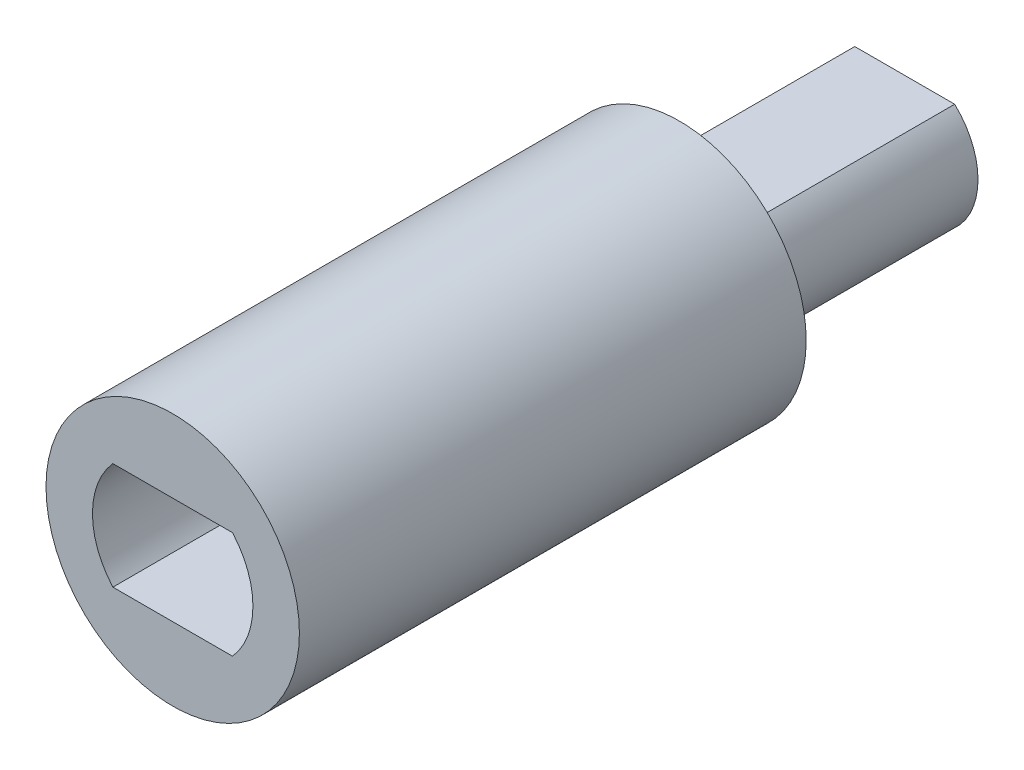
ISO-10303-21;
HEADER;
FILE_DESCRIPTION(('STEP AP214'),'2;1');
FILE_NAME('part.step','',(''),(''),'','','');
FILE_SCHEMA(('AUTOMOTIVE_DESIGN { 1 0 10303 214 1 1 1 1 }'));
ENDSEC;
DATA;
#1=APPLICATION_CONTEXT('core data for automotive mechanical design processes');
#2=APPLICATION_PROTOCOL_DEFINITION('international standard','automotive_design',2000,#1);
#3=PRODUCT_CONTEXT('',#1,'mechanical');
#4=PRODUCT('Part','Part','',(#3));
#5=PRODUCT_RELATED_PRODUCT_CATEGORY('part','',(#4));
#6=PRODUCT_DEFINITION_FORMATION('','',#4);
#7=PRODUCT_DEFINITION_CONTEXT('part definition',#1,'design');
#8=PRODUCT_DEFINITION('design','',#6,#7);
#9=PRODUCT_DEFINITION_SHAPE('','',#8);
#10=(LENGTH_UNIT() NAMED_UNIT(*) SI_UNIT(.MILLI.,.METRE.));
#11=(NAMED_UNIT(*) PLANE_ANGLE_UNIT() SI_UNIT($,.RADIAN.));
#12=(NAMED_UNIT(*) SI_UNIT($,.STERADIAN.) SOLID_ANGLE_UNIT());
#13=UNCERTAINTY_MEASURE_WITH_UNIT(LENGTH_MEASURE(1.E-05),#10,'distance_accuracy_value','');
#14=(GEOMETRIC_REPRESENTATION_CONTEXT(3) GLOBAL_UNCERTAINTY_ASSIGNED_CONTEXT((#13)) GLOBAL_UNIT_ASSIGNED_CONTEXT((#10,
#11,#12)) REPRESENTATION_CONTEXT('',''));
#15=CARTESIAN_POINT('',(0.,0.,0.));
#16=DIRECTION('',(0.,0.,1.));
#17=DIRECTION('',(1.,0.,0.));
#18=AXIS2_PLACEMENT_3D('',#15,#16,#17);
#19=CARTESIAN_POINT('',(0.,0.,18.));
#20=DIRECTION('',(0.,0.,-1.));
#21=DIRECTION('',(-1.,0.,0.));
#22=AXIS2_PLACEMENT_3D('',#19,#20,#21);
#23=CYLINDRICAL_SURFACE('',#22,4.5);
#24=CARTESIAN_POINT('',(0.,0.,18.));
#25=DIRECTION('',(0.,0.,1.));
#26=DIRECTION('',(1.,0.,0.));
#27=AXIS2_PLACEMENT_3D('',#24,#25,#26);
#28=CIRCLE('',#27,4.5);
#29=CARTESIAN_POINT('',(4.5,0.,18.));
#30=VERTEX_POINT('',#29);
#31=EDGE_CURVE('E11',#30,#30,#28,.T.);
#32=ORIENTED_EDGE('',*,*,#31,.F.);
#33=EDGE_LOOP('',(#32));
#34=FACE_BOUND('',#33,.T.);
#35=CARTESIAN_POINT('',(0.,0.,0.));
#36=DIRECTION('',(0.,0.,1.));
#37=DIRECTION('',(1.,0.,0.));
#38=AXIS2_PLACEMENT_3D('',#35,#36,#37);
#39=CIRCLE('',#38,4.5);
#40=CARTESIAN_POINT('',(4.5,0.,0.));
#41=VERTEX_POINT('',#40);
#42=EDGE_CURVE('E36',#41,#41,#39,.T.);
#43=ORIENTED_EDGE('',*,*,#42,.T.);
#44=EDGE_LOOP('',(#43));
#45=FACE_BOUND('',#44,.T.);
#46=ADVANCED_FACE('F33',(#34,#45),#23,.T.);
#47=CARTESIAN_POINT('',(0.,0.,18.));
#48=DIRECTION('',(0.,0.,1.));
#49=DIRECTION('',(1.,0.,0.));
#50=AXIS2_PLACEMENT_3D('',#47,#48,#49);
#51=PLANE('',#50);
#52=CARTESIAN_POINT('',(0.,0.,18.));
#53=DIRECTION('',(0.,0.,1.));
#54=DIRECTION('',(1.,0.,0.));
#55=AXIS2_PLACEMENT_3D('',#52,#53,#54);
#56=CIRCLE('',#55,2.85);
#57=CARTESIAN_POINT('',(-2.1242645786248,1.9,18.));
#58=VERTEX_POINT('',#57);
#59=CARTESIAN_POINT('',(-2.1242645786248,-1.9,18.));
#60=VERTEX_POINT('',#59);
#61=EDGE_CURVE('E47',#58,#60,#56,.T.);
#62=ORIENTED_EDGE('',*,*,#61,.F.);
#63=DIRECTION('',(-1.,0.,0.));
#64=VECTOR('',#63,1.);
#65=CARTESIAN_POINT('',(0.,1.9,18.));
#66=LINE('',#65,#64);
#67=CARTESIAN_POINT('',(2.1242645786248,1.9,18.));
#68=VERTEX_POINT('',#67);
#69=EDGE_CURVE('E117',#68,#58,#66,.T.);
#70=ORIENTED_EDGE('',*,*,#69,.F.);
#71=CARTESIAN_POINT('',(0.,0.,18.));
#72=DIRECTION('',(0.,0.,1.));
#73=DIRECTION('',(1.,0.,0.));
#74=AXIS2_PLACEMENT_3D('',#71,#72,#73);
#75=CIRCLE('',#74,2.85);
#76=CARTESIAN_POINT('',(2.1242645786248,-1.9,18.));
#77=VERTEX_POINT('',#76);
#78=EDGE_CURVE('E120',#77,#68,#75,.T.);
#79=ORIENTED_EDGE('',*,*,#78,.F.);
#80=DIRECTION('',(-1.,0.,0.));
#81=VECTOR('',#80,1.);
#82=CARTESIAN_POINT('',(0.,-1.9,18.));
#83=LINE('',#82,#81);
#84=EDGE_CURVE('E126',#77,#60,#83,.T.);
#85=ORIENTED_EDGE('',*,*,#84,.T.);
#86=EDGE_LOOP('',(#62,#70,#79,#85));
#87=FACE_BOUND('',#86,.T.);
#88=ORIENTED_EDGE('',*,*,#31,.T.);
#89=EDGE_LOOP('',(#88));
#90=FACE_BOUND('',#89,.T.);
#91=ADVANCED_FACE('F192',(#87,#90),#51,.T.);
#92=CARTESIAN_POINT('',(0.,0.,0.));
#93=DIRECTION('',(0.,0.,1.));
#94=DIRECTION('',(1.,0.,0.));
#95=AXIS2_PLACEMENT_3D('',#92,#93,#94);
#96=PLANE('',#95);
#97=DIRECTION('',(1.,0.,0.));
#98=VECTOR('',#97,1.);
#99=CARTESIAN_POINT('',(1.97339969930355,-1.69638982246842,0.));
#100=LINE('',#99,#98);
#101=CARTESIAN_POINT('',(-1.97339969930355,-1.69638982246842,0.));
#102=VERTEX_POINT('',#101);
#103=CARTESIAN_POINT('',(1.97339969930355,-1.69638982246842,0.));
#104=VERTEX_POINT('',#103);
#105=EDGE_CURVE('E139',#102,#104,#100,.T.);
#106=ORIENTED_EDGE('',*,*,#105,.T.);
#107=CARTESIAN_POINT('',(0.,0.,0.));
#108=DIRECTION('',(0.,0.,1.));
#109=DIRECTION('',(1.,0.,0.));
#110=AXIS2_PLACEMENT_3D('',#107,#108,#109);
#111=CIRCLE('',#110,2.6023152773993);
#112=CARTESIAN_POINT('',(1.77434863963765,1.90361017753158,0.));
#113=VERTEX_POINT('',#112);
#114=EDGE_CURVE('E55',#104,#113,#111,.T.);
#115=ORIENTED_EDGE('',*,*,#114,.T.);
#116=DIRECTION('',(-1.,0.,0.));
#117=VECTOR('',#116,1.);
#118=CARTESIAN_POINT('',(1.77434863963765,1.90361017753158,0.));
#119=LINE('',#118,#117);
#120=CARTESIAN_POINT('',(-1.77434863963765,1.90361017753158,0.));
#121=VERTEX_POINT('',#120);
#122=EDGE_CURVE('E150',#113,#121,#119,.T.);
#123=ORIENTED_EDGE('',*,*,#122,.T.);
#124=CARTESIAN_POINT('',(0.,0.,0.));
#125=DIRECTION('',(0.,0.,1.));
#126=DIRECTION('',(1.,0.,0.));
#127=AXIS2_PLACEMENT_3D('',#124,#125,#126);
#128=CIRCLE('',#127,2.6023152773993);
#129=EDGE_CURVE('E153',#121,#102,#128,.T.);
#130=ORIENTED_EDGE('',*,*,#129,.T.);
#131=EDGE_LOOP('',(#106,#115,#123,#130));
#132=FACE_BOUND('',#131,.T.);
#133=ORIENTED_EDGE('',*,*,#42,.F.);
#134=EDGE_LOOP('',(#133));
#135=FACE_BOUND('',#134,.T.);
#136=ADVANCED_FACE('F172',(#132,#135),#96,.F.);
#137=CARTESIAN_POINT('',(0.,0.,-8.));
#138=DIRECTION('',(0.,0.,1.));
#139=DIRECTION('',(1.,0.,0.));
#140=AXIS2_PLACEMENT_3D('',#137,#138,#139);
#141=CYLINDRICAL_SURFACE('',#140,2.6023152773993);
#142=ORIENTED_EDGE('',*,*,#114,.F.);
#143=DIRECTION('',(0.,0.,1.));
#144=VECTOR('',#143,1.);
#145=CARTESIAN_POINT('',(1.97339969930355,-1.69638982246842,-8.));
#146=LINE('',#145,#144);
#147=CARTESIAN_POINT('',(1.97339969930355,-1.69638982246842,-8.));
#148=VERTEX_POINT('',#147);
#149=EDGE_CURVE('E158',#148,#104,#146,.T.);
#150=ORIENTED_EDGE('',*,*,#149,.F.);
#151=CARTESIAN_POINT('',(0.,0.,-8.));
#152=DIRECTION('',(0.,0.,1.));
#153=DIRECTION('',(1.,0.,0.));
#154=AXIS2_PLACEMENT_3D('',#151,#152,#153);
#155=CIRCLE('',#154,2.6023152773993);
#156=CARTESIAN_POINT('',(1.77434863963765,1.90361017753158,-8.));
#157=VERTEX_POINT('',#156);
#158=EDGE_CURVE('E135',#148,#157,#155,.T.);
#159=ORIENTED_EDGE('',*,*,#158,.T.);
#160=DIRECTION('',(0.,0.,1.));
#161=VECTOR('',#160,1.);
#162=CARTESIAN_POINT('',(1.77434863963765,1.90361017753158,-8.));
#163=LINE('',#162,#161);
#164=EDGE_CURVE('E148',#157,#113,#163,.T.);
#165=ORIENTED_EDGE('',*,*,#164,.T.);
#166=EDGE_LOOP('',(#142,#150,#159,#165));
#167=FACE_BOUND('',#166,.T.);
#168=ADVANCED_FACE('F165',(#167),#141,.T.);
#169=CARTESIAN_POINT('',(1.97339969930355,-1.69638982246842,-8.));
#170=DIRECTION('',(0.,-1.,0.));
#171=DIRECTION('',(0.,0.,-1.));
#172=AXIS2_PLACEMENT_3D('',#169,#170,#171);
#173=PLANE('',#172);
#174=ORIENTED_EDGE('',*,*,#105,.F.);
#175=DIRECTION('',(0.,0.,1.));
#176=VECTOR('',#175,1.);
#177=CARTESIAN_POINT('',(-1.97339969930355,-1.69638982246842,-8.));
#178=LINE('',#177,#176);
#179=CARTESIAN_POINT('',(-1.97339969930355,-1.69638982246842,-8.));
#180=VERTEX_POINT('',#179);
#181=EDGE_CURVE('E160',#180,#102,#178,.T.);
#182=ORIENTED_EDGE('',*,*,#181,.F.);
#183=DIRECTION('',(1.,0.,0.));
#184=VECTOR('',#183,1.);
#185=CARTESIAN_POINT('',(1.97339969930355,-1.69638982246842,-8.));
#186=LINE('',#185,#184);
#187=EDGE_CURVE('E145',#180,#148,#186,.T.);
#188=ORIENTED_EDGE('',*,*,#187,.T.);
#189=ORIENTED_EDGE('',*,*,#149,.T.);
#190=EDGE_LOOP('',(#174,#182,#188,#189));
#191=FACE_BOUND('',#190,.T.);
#192=ADVANCED_FACE('F176',(#191),#173,.T.);
#193=CARTESIAN_POINT('',(0.,0.,-8.));
#194=DIRECTION('',(0.,0.,1.));
#195=DIRECTION('',(1.,0.,0.));
#196=AXIS2_PLACEMENT_3D('',#193,#194,#195);
#197=CYLINDRICAL_SURFACE('',#196,2.6023152773993);
#198=ORIENTED_EDGE('',*,*,#129,.F.);
#199=DIRECTION('',(0.,0.,1.));
#200=VECTOR('',#199,1.);
#201=CARTESIAN_POINT('',(-1.77434863963765,1.90361017753158,-8.));
#202=LINE('',#201,#200);
#203=CARTESIAN_POINT('',(-1.77434863963765,1.90361017753158,-8.));
#204=VERTEX_POINT('',#203);
#205=EDGE_CURVE('E162',#204,#121,#202,.T.);
#206=ORIENTED_EDGE('',*,*,#205,.F.);
#207=CARTESIAN_POINT('',(0.,0.,-8.));
#208=DIRECTION('',(0.,0.,1.));
#209=DIRECTION('',(1.,0.,0.));
#210=AXIS2_PLACEMENT_3D('',#207,#208,#209);
#211=CIRCLE('',#210,2.6023152773993);
#212=EDGE_CURVE('E142',#204,#180,#211,.T.);
#213=ORIENTED_EDGE('',*,*,#212,.T.);
#214=ORIENTED_EDGE('',*,*,#181,.T.);
#215=EDGE_LOOP('',(#198,#206,#213,#214));
#216=FACE_BOUND('',#215,.T.);
#217=ADVANCED_FACE('F182',(#216),#197,.T.);
#218=CARTESIAN_POINT('',(1.77434863963765,1.90361017753158,-8.));
#219=DIRECTION('',(0.,1.,0.));
#220=DIRECTION('',(0.,0.,1.));
#221=AXIS2_PLACEMENT_3D('',#218,#219,#220);
#222=PLANE('',#221);
#223=ORIENTED_EDGE('',*,*,#122,.F.);
#224=ORIENTED_EDGE('',*,*,#164,.F.);
#225=DIRECTION('',(-1.,0.,0.));
#226=VECTOR('',#225,1.);
#227=CARTESIAN_POINT('',(1.77434863963765,1.90361017753158,-8.));
#228=LINE('',#227,#226);
#229=EDGE_CURVE('E138',#157,#204,#228,.T.);
#230=ORIENTED_EDGE('',*,*,#229,.T.);
#231=ORIENTED_EDGE('',*,*,#205,.T.);
#232=EDGE_LOOP('',(#223,#224,#230,#231));
#233=FACE_BOUND('',#232,.T.);
#234=ADVANCED_FACE('F169',(#233),#222,.T.);
#235=CARTESIAN_POINT('',(0.,0.,-8.));
#236=DIRECTION('',(0.,0.,1.));
#237=DIRECTION('',(1.,0.,0.));
#238=AXIS2_PLACEMENT_3D('',#235,#236,#237);
#239=PLANE('',#238);
#240=ORIENTED_EDGE('',*,*,#158,.F.);
#241=ORIENTED_EDGE('',*,*,#187,.F.);
#242=ORIENTED_EDGE('',*,*,#212,.F.);
#243=ORIENTED_EDGE('',*,*,#229,.F.);
#244=EDGE_LOOP('',(#240,#241,#242,#243));
#245=FACE_BOUND('',#244,.T.);
#246=ADVANCED_FACE('F179',(#245),#239,.F.);
#247=CARTESIAN_POINT('',(0.,0.,10.));
#248=DIRECTION('',(0.,0.,1.));
#249=DIRECTION('',(1.,0.,0.));
#250=AXIS2_PLACEMENT_3D('',#247,#248,#249);
#251=CYLINDRICAL_SURFACE('',#250,2.85);
#252=ORIENTED_EDGE('',*,*,#61,.T.);
#253=DIRECTION('',(0.,0.,1.));
#254=VECTOR('',#253,1.);
#255=CARTESIAN_POINT('',(-2.1242645786248,-1.9,10.));
#256=LINE('',#255,#254);
#257=CARTESIAN_POINT('',(-2.1242645786248,-1.9,10.));
#258=VERTEX_POINT('',#257);
#259=EDGE_CURVE('E100',#258,#60,#256,.T.);
#260=ORIENTED_EDGE('',*,*,#259,.F.);
#261=CARTESIAN_POINT('',(0.,0.,10.));
#262=DIRECTION('',(0.,0.,1.));
#263=DIRECTION('',(1.,0.,0.));
#264=AXIS2_PLACEMENT_3D('',#261,#262,#263);
#265=CIRCLE('',#264,2.85);
#266=CARTESIAN_POINT('',(-2.1242645786248,1.9,10.));
#267=VERTEX_POINT('',#266);
#268=EDGE_CURVE('E108',#267,#258,#265,.T.);
#269=ORIENTED_EDGE('',*,*,#268,.F.);
#270=DIRECTION('',(0.,0.,1.));
#271=VECTOR('',#270,1.);
#272=CARTESIAN_POINT('',(-2.1242645786248,1.9,10.));
#273=LINE('',#272,#271);
#274=EDGE_CURVE('E130',#267,#58,#273,.T.);
#275=ORIENTED_EDGE('',*,*,#274,.T.);
#276=EDGE_LOOP('',(#252,#260,#269,#275));
#277=FACE_BOUND('',#276,.T.);
#278=ADVANCED_FACE('F111',(#277),#251,.F.);
#279=CARTESIAN_POINT('',(0.,1.9,10.));
#280=DIRECTION('',(0.,1.,0.));
#281=DIRECTION('',(-1.,0.,0.));
#282=AXIS2_PLACEMENT_3D('',#279,#280,#281);
#283=PLANE('',#282);
#284=ORIENTED_EDGE('',*,*,#69,.T.);
#285=ORIENTED_EDGE('',*,*,#274,.F.);
#286=DIRECTION('',(-1.,0.,0.));
#287=VECTOR('',#286,1.);
#288=CARTESIAN_POINT('',(0.,1.9,10.));
#289=LINE('',#288,#287);
#290=CARTESIAN_POINT('',(2.1242645786248,1.9,10.));
#291=VERTEX_POINT('',#290);
#292=EDGE_CURVE('E113',#291,#267,#289,.T.);
#293=ORIENTED_EDGE('',*,*,#292,.F.);
#294=DIRECTION('',(0.,0.,1.));
#295=VECTOR('',#294,1.);
#296=CARTESIAN_POINT('',(2.1242645786248,1.9,10.));
#297=LINE('',#296,#295);
#298=EDGE_CURVE('E132',#291,#68,#297,.T.);
#299=ORIENTED_EDGE('',*,*,#298,.T.);
#300=EDGE_LOOP('',(#284,#285,#293,#299));
#301=FACE_BOUND('',#300,.T.);
#302=ADVANCED_FACE('F249',(#301),#283,.F.);
#303=CARTESIAN_POINT('',(0.,0.,10.));
#304=DIRECTION('',(0.,0.,1.));
#305=DIRECTION('',(1.,0.,0.));
#306=AXIS2_PLACEMENT_3D('',#303,#304,#305);
#307=CYLINDRICAL_SURFACE('',#306,2.85);
#308=ORIENTED_EDGE('',*,*,#78,.T.);
#309=ORIENTED_EDGE('',*,*,#298,.F.);
#310=CARTESIAN_POINT('',(0.,0.,10.));
#311=DIRECTION('',(0.,0.,1.));
#312=DIRECTION('',(1.,0.,0.));
#313=AXIS2_PLACEMENT_3D('',#310,#311,#312);
#314=CIRCLE('',#313,2.85);
#315=CARTESIAN_POINT('',(2.1242645786248,-1.9,10.));
#316=VERTEX_POINT('',#315);
#317=EDGE_CURVE('E107',#316,#291,#314,.T.);
#318=ORIENTED_EDGE('',*,*,#317,.F.);
#319=DIRECTION('',(0.,0.,1.));
#320=VECTOR('',#319,1.);
#321=CARTESIAN_POINT('',(2.1242645786248,-1.9,10.));
#322=LINE('',#321,#320);
#323=EDGE_CURVE('E102',#316,#77,#322,.T.);
#324=ORIENTED_EDGE('',*,*,#323,.T.);
#325=EDGE_LOOP('',(#308,#309,#318,#324));
#326=FACE_BOUND('',#325,.T.);
#327=ADVANCED_FACE('F258',(#326),#307,.F.);
#328=CARTESIAN_POINT('',(0.,-1.9,10.));
#329=DIRECTION('',(0.,1.,0.));
#330=DIRECTION('',(-1.,0.,0.));
#331=AXIS2_PLACEMENT_3D('',#328,#329,#330);
#332=PLANE('',#331);
#333=ORIENTED_EDGE('',*,*,#84,.F.);
#334=ORIENTED_EDGE('',*,*,#323,.F.);
#335=DIRECTION('',(-1.,0.,0.));
#336=VECTOR('',#335,1.);
#337=CARTESIAN_POINT('',(0.,-1.9,10.));
#338=LINE('',#337,#336);
#339=EDGE_CURVE('E97',#316,#258,#338,.T.);
#340=ORIENTED_EDGE('',*,*,#339,.T.);
#341=ORIENTED_EDGE('',*,*,#259,.T.);
#342=EDGE_LOOP('',(#333,#334,#340,#341));
#343=FACE_BOUND('',#342,.T.);
#344=ADVANCED_FACE('F99',(#343),#332,.T.);
#345=CARTESIAN_POINT('',(0.,0.,10.));
#346=DIRECTION('',(0.,0.,1.));
#347=DIRECTION('',(1.,0.,0.));
#348=AXIS2_PLACEMENT_3D('',#345,#346,#347);
#349=PLANE('',#348);
#350=ORIENTED_EDGE('',*,*,#268,.T.);
#351=ORIENTED_EDGE('',*,*,#339,.F.);
#352=ORIENTED_EDGE('',*,*,#317,.T.);
#353=ORIENTED_EDGE('',*,*,#292,.T.);
#354=EDGE_LOOP('',(#350,#351,#352,#353));
#355=FACE_BOUND('',#354,.T.);
#356=ADVANCED_FACE('F115',(#355),#349,.T.);
#357=CLOSED_SHELL('',(#46,#91,#136,#168,#192,#217,#234,#246,#278,#302,#327,#344,#356));
#358=MANIFOLD_SOLID_BREP('B2',#357);
#359=ADVANCED_BREP_SHAPE_REPRESENTATION('',(#18,#358),#14);
#360=SHAPE_DEFINITION_REPRESENTATION(#9,#359);
ENDSEC;
END-ISO-10303-21;
